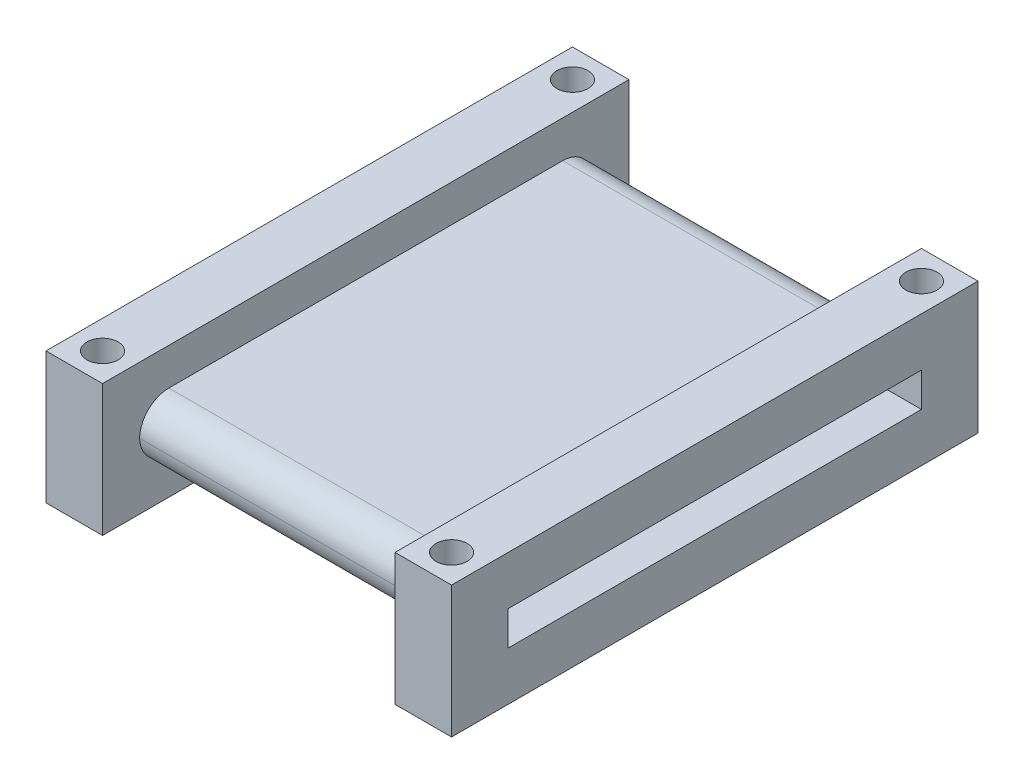
ISO-10303-21;
HEADER;
FILE_DESCRIPTION(('STEP AP214'),'2;1');
FILE_NAME('part.step','',(''),(''),'','','');
FILE_SCHEMA(('AUTOMOTIVE_DESIGN { 1 0 10303 214 1 1 1 1 }'));
ENDSEC;
DATA;
#1=APPLICATION_CONTEXT('core data for automotive mechanical design processes');
#2=APPLICATION_PROTOCOL_DEFINITION('international standard','automotive_design',2000,#1);
#3=PRODUCT_CONTEXT('',#1,'mechanical');
#4=PRODUCT('Part','Part','',(#3));
#5=PRODUCT_RELATED_PRODUCT_CATEGORY('part','',(#4));
#6=PRODUCT_DEFINITION_FORMATION('','',#4);
#7=PRODUCT_DEFINITION_CONTEXT('part definition',#1,'design');
#8=PRODUCT_DEFINITION('design','',#6,#7);
#9=PRODUCT_DEFINITION_SHAPE('','',#8);
#10=(LENGTH_UNIT() NAMED_UNIT(*) SI_UNIT(.MILLI.,.METRE.));
#11=(NAMED_UNIT(*) PLANE_ANGLE_UNIT() SI_UNIT($,.RADIAN.));
#12=(NAMED_UNIT(*) SI_UNIT($,.STERADIAN.) SOLID_ANGLE_UNIT());
#13=UNCERTAINTY_MEASURE_WITH_UNIT(LENGTH_MEASURE(1.E-05),#10,'distance_accuracy_value','');
#14=(GEOMETRIC_REPRESENTATION_CONTEXT(3) GLOBAL_UNCERTAINTY_ASSIGNED_CONTEXT((#13)) GLOBAL_UNIT_ASSIGNED_CONTEXT((#10,
#11,#12)) REPRESENTATION_CONTEXT('',''));
#15=CARTESIAN_POINT('',(0.,0.,0.));
#16=DIRECTION('',(0.,0.,1.));
#17=DIRECTION('',(1.,0.,0.));
#18=AXIS2_PLACEMENT_3D('',#15,#16,#17);
#19=CARTESIAN_POINT('',(30.,0.,0.));
#20=DIRECTION('',(0.,1.,0.));
#21=DIRECTION('',(0.,0.,1.));
#22=AXIS2_PLACEMENT_3D('',#19,#20,#21);
#23=PLANE('',#22);
#24=DIRECTION('',(0.,0.,-1.));
#25=VECTOR('',#24,1.);
#26=CARTESIAN_POINT('',(0.,0.,0.));
#27=LINE('',#26,#25);
#28=CARTESIAN_POINT('',(0.,0.,-3.));
#29=VERTEX_POINT('',#28);
#30=CARTESIAN_POINT('',(0.,0.,-43.4));
#31=VERTEX_POINT('',#30);
#32=EDGE_CURVE('E312',#29,#31,#27,.T.);
#33=ORIENTED_EDGE('',*,*,#32,.T.);
#34=DIRECTION('',(-1.,0.,0.));
#35=VECTOR('',#34,1.);
#36=CARTESIAN_POINT('',(30.,0.,-43.4));
#37=LINE('',#36,#35);
#38=CARTESIAN_POINT('',(30.,0.,-43.4));
#39=VERTEX_POINT('',#38);
#40=EDGE_CURVE('E347',#31,#39,#37,.F.);
#41=ORIENTED_EDGE('',*,*,#40,.T.);
#42=DIRECTION('',(0.,0.,-1.));
#43=VECTOR('',#42,1.);
#44=CARTESIAN_POINT('',(30.,0.,0.));
#45=LINE('',#44,#43);
#46=CARTESIAN_POINT('',(30.,0.,-3.));
#47=VERTEX_POINT('',#46);
#48=EDGE_CURVE('E313',#47,#39,#45,.T.);
#49=ORIENTED_EDGE('',*,*,#48,.F.);
#50=DIRECTION('',(-1.,0.,0.));
#51=VECTOR('',#50,1.);
#52=CARTESIAN_POINT('',(30.,0.,-3.));
#53=LINE('',#52,#51);
#54=EDGE_CURVE('E343',#47,#29,#53,.T.);
#55=ORIENTED_EDGE('',*,*,#54,.T.);
#56=EDGE_LOOP('',(#33,#41,#49,#55));
#57=FACE_BOUND('',#56,.T.);
#58=ADVANCED_FACE('F43',(#57),#23,.F.);
#59=CARTESIAN_POINT('',(30.,5.9,0.));
#60=DIRECTION('',(0.,-1.,0.));
#61=DIRECTION('',(0.,0.,-1.));
#62=AXIS2_PLACEMENT_3D('',#59,#60,#61);
#63=PLANE('',#62);
#64=DIRECTION('',(0.,0.,1.));
#65=VECTOR('',#64,1.);
#66=CARTESIAN_POINT('',(0.,5.9,0.));
#67=LINE('',#66,#65);
#68=CARTESIAN_POINT('',(0.,5.9,-43.4));
#69=VERTEX_POINT('',#68);
#70=CARTESIAN_POINT('',(0.,5.9,-3.));
#71=VERTEX_POINT('',#70);
#72=EDGE_CURVE('E318',#69,#71,#67,.T.);
#73=ORIENTED_EDGE('',*,*,#72,.T.);
#74=DIRECTION('',(-1.,0.,0.));
#75=VECTOR('',#74,1.);
#76=CARTESIAN_POINT('',(30.,5.9,-3.));
#77=LINE('',#76,#75);
#78=CARTESIAN_POINT('',(30.,5.9,-3.));
#79=VERTEX_POINT('',#78);
#80=EDGE_CURVE('E11',#71,#79,#77,.F.);
#81=ORIENTED_EDGE('',*,*,#80,.T.);
#82=DIRECTION('',(0.,0.,1.));
#83=VECTOR('',#82,1.);
#84=CARTESIAN_POINT('',(30.,5.9,0.));
#85=LINE('',#84,#83);
#86=CARTESIAN_POINT('',(30.,5.9,-43.4));
#87=VERTEX_POINT('',#86);
#88=EDGE_CURVE('E317',#87,#79,#85,.T.);
#89=ORIENTED_EDGE('',*,*,#88,.F.);
#90=DIRECTION('',(-1.,0.,0.));
#91=VECTOR('',#90,1.);
#92=CARTESIAN_POINT('',(30.,5.9,-43.4));
#93=LINE('',#92,#91);
#94=EDGE_CURVE('E53',#87,#69,#93,.T.);
#95=ORIENTED_EDGE('',*,*,#94,.T.);
#96=EDGE_LOOP('',(#73,#81,#89,#95));
#97=FACE_BOUND('',#96,.T.);
#98=ADVANCED_FACE('F383',(#97),#63,.F.);
#99=CARTESIAN_POINT('',(30.,1.2,-44.4));
#100=DIRECTION('',(0.,0.,1.));
#101=DIRECTION('',(1.,0.,0.));
#102=AXIS2_PLACEMENT_3D('',#99,#100,#101);
#103=PLANE('',#102);
#104=DIRECTION('',(-1.,0.,0.));
#105=VECTOR('',#104,1.);
#106=CARTESIAN_POINT('',(30.,4.7,-44.4));
#107=LINE('',#106,#105);
#108=CARTESIAN_POINT('',(35.8,4.7,-44.4));
#109=VERTEX_POINT('',#108);
#110=CARTESIAN_POINT('',(-5.8,4.7,-44.4));
#111=VERTEX_POINT('',#110);
#112=EDGE_CURVE('E189',#109,#111,#107,.T.);
#113=ORIENTED_EDGE('',*,*,#112,.T.);
#114=DIRECTION('',(0.,-1.,0.));
#115=VECTOR('',#114,1.);
#116=CARTESIAN_POINT('',(-5.8,1.2,-44.4));
#117=LINE('',#116,#115);
#118=CARTESIAN_POINT('',(-5.8,1.2,-44.4));
#119=VERTEX_POINT('',#118);
#120=EDGE_CURVE('E187',#111,#119,#117,.T.);
#121=ORIENTED_EDGE('',*,*,#120,.T.);
#122=DIRECTION('',(-1.,0.,0.));
#123=VECTOR('',#122,1.);
#124=CARTESIAN_POINT('',(30.,1.2,-44.4));
#125=LINE('',#124,#123);
#126=CARTESIAN_POINT('',(35.8,1.2,-44.4));
#127=VERTEX_POINT('',#126);
#128=EDGE_CURVE('E171',#127,#119,#125,.T.);
#129=ORIENTED_EDGE('',*,*,#128,.F.);
#130=DIRECTION('',(0.,1.,0.));
#131=VECTOR('',#130,1.);
#132=CARTESIAN_POINT('',(35.8,1.2,-44.4));
#133=LINE('',#132,#131);
#134=EDGE_CURVE('E256',#127,#109,#133,.T.);
#135=ORIENTED_EDGE('',*,*,#134,.T.);
#136=EDGE_LOOP('',(#113,#121,#129,#135));
#137=FACE_BOUND('',#136,.T.);
#138=ADVANCED_FACE('F188',(#137),#103,.T.);
#139=CARTESIAN_POINT('',(30.,4.7,-2.));
#140=DIRECTION('',(0.,-1.,0.));
#141=DIRECTION('',(0.,0.,-1.));
#142=AXIS2_PLACEMENT_3D('',#139,#140,#141);
#143=PLANE('',#142);
#144=DIRECTION('',(-1.,0.,0.));
#145=VECTOR('',#144,1.);
#146=CARTESIAN_POINT('',(30.,4.7,-2.));
#147=LINE('',#146,#145);
#148=CARTESIAN_POINT('',(35.8,4.7,-2.));
#149=VERTEX_POINT('',#148);
#150=CARTESIAN_POINT('',(-5.8,4.7,-2.));
#151=VERTEX_POINT('',#150);
#152=EDGE_CURVE('E307',#149,#151,#147,.T.);
#153=ORIENTED_EDGE('',*,*,#152,.T.);
#154=DIRECTION('',(0.,0.,-1.));
#155=VECTOR('',#154,1.);
#156=CARTESIAN_POINT('',(-5.8,4.7,-2.));
#157=LINE('',#156,#155);
#158=EDGE_CURVE('E202',#151,#111,#157,.T.);
#159=ORIENTED_EDGE('',*,*,#158,.T.);
#160=ORIENTED_EDGE('',*,*,#112,.F.);
#161=DIRECTION('',(0.,0.,1.));
#162=VECTOR('',#161,1.);
#163=CARTESIAN_POINT('',(35.8,4.7,-44.4));
#164=LINE('',#163,#162);
#165=EDGE_CURVE('E259',#109,#149,#164,.T.);
#166=ORIENTED_EDGE('',*,*,#165,.T.);
#167=EDGE_LOOP('',(#153,#159,#160,#166));
#168=FACE_BOUND('',#167,.T.);
#169=ADVANCED_FACE('F403',(#168),#143,.T.);
#170=CARTESIAN_POINT('',(30.,1.2,-2.));
#171=DIRECTION('',(0.,0.,-1.));
#172=DIRECTION('',(-1.,0.,0.));
#173=AXIS2_PLACEMENT_3D('',#170,#171,#172);
#174=PLANE('',#173);
#175=DIRECTION('',(-1.,0.,0.));
#176=VECTOR('',#175,1.);
#177=CARTESIAN_POINT('',(30.,1.2,-2.));
#178=LINE('',#177,#176);
#179=CARTESIAN_POINT('',(35.8,1.2,-2.));
#180=VERTEX_POINT('',#179);
#181=CARTESIAN_POINT('',(-5.8,1.2,-2.));
#182=VERTEX_POINT('',#181);
#183=EDGE_CURVE('E183',#180,#182,#178,.T.);
#184=ORIENTED_EDGE('',*,*,#183,.T.);
#185=DIRECTION('',(0.,1.,0.));
#186=VECTOR('',#185,1.);
#187=CARTESIAN_POINT('',(-5.8,1.2,-2.));
#188=LINE('',#187,#186);
#189=EDGE_CURVE('E198',#182,#151,#188,.T.);
#190=ORIENTED_EDGE('',*,*,#189,.T.);
#191=ORIENTED_EDGE('',*,*,#152,.F.);
#192=DIRECTION('',(0.,-1.,0.));
#193=VECTOR('',#192,1.);
#194=CARTESIAN_POINT('',(35.8,1.2,-2.));
#195=LINE('',#194,#193);
#196=EDGE_CURVE('E250',#149,#180,#195,.T.);
#197=ORIENTED_EDGE('',*,*,#196,.T.);
#198=EDGE_LOOP('',(#184,#190,#191,#197));
#199=FACE_BOUND('',#198,.T.);
#200=ADVANCED_FACE('F406',(#199),#174,.T.);
#201=CARTESIAN_POINT('',(30.,1.2,-2.));
#202=DIRECTION('',(0.,1.,0.));
#203=DIRECTION('',(0.,0.,1.));
#204=AXIS2_PLACEMENT_3D('',#201,#202,#203);
#205=PLANE('',#204);
#206=ORIENTED_EDGE('',*,*,#128,.T.);
#207=DIRECTION('',(0.,0.,1.));
#208=VECTOR('',#207,1.);
#209=CARTESIAN_POINT('',(-5.8,1.2,-2.));
#210=LINE('',#209,#208);
#211=EDGE_CURVE('E175',#119,#182,#210,.T.);
#212=ORIENTED_EDGE('',*,*,#211,.T.);
#213=ORIENTED_EDGE('',*,*,#183,.F.);
#214=DIRECTION('',(0.,0.,-1.));
#215=VECTOR('',#214,1.);
#216=CARTESIAN_POINT('',(35.8,1.2,-44.4));
#217=LINE('',#216,#215);
#218=EDGE_CURVE('E178',#180,#127,#217,.T.);
#219=ORIENTED_EDGE('',*,*,#218,.T.);
#220=EDGE_LOOP('',(#206,#212,#213,#219));
#221=FACE_BOUND('',#220,.T.);
#222=ADVANCED_FACE('F173',(#221),#205,.T.);
#223=CARTESIAN_POINT('',(30.,2.9,-43.4));
#224=DIRECTION('',(-1.,0.,0.));
#225=DIRECTION('',(0.,0.,1.));
#226=AXIS2_PLACEMENT_3D('',#223,#224,#225);
#227=CYLINDRICAL_SURFACE('',#226,3.);
#228=ORIENTED_EDGE('',*,*,#94,.F.);
#229=CARTESIAN_POINT('',(30.,2.9,-43.4));
#230=DIRECTION('',(-1.,0.,0.));
#231=DIRECTION('',(0.,0.,1.));
#232=AXIS2_PLACEMENT_3D('',#229,#230,#231);
#233=CIRCLE('',#232,3.);
#234=CARTESIAN_POINT('',(30.,2.95,-46.3995833043941));
#235=VERTEX_POINT('',#234);
#236=EDGE_CURVE('E68',#235,#87,#233,.F.);
#237=ORIENTED_EDGE('',*,*,#236,.F.);
#238=DIRECTION('',(-1.,0.,0.));
#239=VECTOR('',#238,1.);
#240=CARTESIAN_POINT('',(15.,2.95,-46.3995833043941));
#241=LINE('',#240,#239);
#242=CARTESIAN_POINT('',(0.,2.95,-46.3995833043941));
#243=VERTEX_POINT('',#242);
#244=EDGE_CURVE('E184',#243,#235,#241,.F.);
#245=ORIENTED_EDGE('',*,*,#244,.F.);
#246=CARTESIAN_POINT('',(0.,2.9,-43.4));
#247=DIRECTION('',(-1.,0.,0.));
#248=DIRECTION('',(0.,0.,1.));
#249=AXIS2_PLACEMENT_3D('',#246,#247,#248);
#250=CIRCLE('',#249,3.);
#251=EDGE_CURVE('E322',#69,#243,#250,.T.);
#252=ORIENTED_EDGE('',*,*,#251,.F.);
#253=EDGE_LOOP('',(#228,#237,#245,#252));
#254=FACE_BOUND('',#253,.T.);
#255=ADVANCED_FACE('F385',(#254),#227,.T.);
#256=CARTESIAN_POINT('',(30.,3.,-43.4));
#257=DIRECTION('',(-1.,0.,0.));
#258=DIRECTION('',(0.,0.,1.));
#259=AXIS2_PLACEMENT_3D('',#256,#257,#258);
#260=CYLINDRICAL_SURFACE('',#259,3.);
#261=CARTESIAN_POINT('',(30.,3.,-43.4));
#262=DIRECTION('',(-1.,0.,0.));
#263=DIRECTION('',(0.,0.,1.));
#264=AXIS2_PLACEMENT_3D('',#261,#262,#263);
#265=CIRCLE('',#264,3.);
#266=EDGE_CURVE('E353',#39,#235,#265,.F.);
#267=ORIENTED_EDGE('',*,*,#266,.F.);
#268=ORIENTED_EDGE('',*,*,#40,.F.);
#269=CARTESIAN_POINT('',(0.,3.,-43.4));
#270=DIRECTION('',(-1.,0.,0.));
#271=DIRECTION('',(0.,0.,1.));
#272=AXIS2_PLACEMENT_3D('',#269,#270,#271);
#273=CIRCLE('',#272,3.);
#274=EDGE_CURVE('E331',#243,#31,#273,.T.);
#275=ORIENTED_EDGE('',*,*,#274,.F.);
#276=ORIENTED_EDGE('',*,*,#244,.T.);
#277=EDGE_LOOP('',(#267,#268,#275,#276));
#278=FACE_BOUND('',#277,.T.);
#279=ADVANCED_FACE('F386',(#278),#260,.T.);
#280=CARTESIAN_POINT('',(30.,2.9,-3.));
#281=DIRECTION('',(-1.,0.,0.));
#282=DIRECTION('',(0.,0.,1.));
#283=AXIS2_PLACEMENT_3D('',#280,#281,#282);
#284=CYLINDRICAL_SURFACE('',#283,3.);
#285=DIRECTION('',(-1.,0.,0.));
#286=VECTOR('',#285,1.);
#287=CARTESIAN_POINT('',(15.,2.95,-0.000416695605871559));
#288=LINE('',#287,#286);
#289=CARTESIAN_POINT('',(30.,2.95,-0.000416695605871126));
#290=VERTEX_POINT('',#289);
#291=CARTESIAN_POINT('',(0.,2.95,-0.000416695605871126));
#292=VERTEX_POINT('',#291);
#293=EDGE_CURVE('E47',#290,#292,#288,.T.);
#294=ORIENTED_EDGE('',*,*,#293,.F.);
#295=CARTESIAN_POINT('',(30.,2.9,-3.));
#296=DIRECTION('',(-1.,0.,0.));
#297=DIRECTION('',(0.,0.,1.));
#298=AXIS2_PLACEMENT_3D('',#295,#296,#297);
#299=CIRCLE('',#298,3.);
#300=EDGE_CURVE('E357',#79,#290,#299,.F.);
#301=ORIENTED_EDGE('',*,*,#300,.F.);
#302=ORIENTED_EDGE('',*,*,#80,.F.);
#303=CARTESIAN_POINT('',(0.,2.9,-3.));
#304=DIRECTION('',(-1.,0.,0.));
#305=DIRECTION('',(0.,0.,1.));
#306=AXIS2_PLACEMENT_3D('',#303,#304,#305);
#307=CIRCLE('',#306,3.);
#308=EDGE_CURVE('E335',#292,#71,#307,.T.);
#309=ORIENTED_EDGE('',*,*,#308,.F.);
#310=EDGE_LOOP('',(#294,#301,#302,#309));
#311=FACE_BOUND('',#310,.T.);
#312=ADVANCED_FACE('F45',(#311),#284,.T.);
#313=CARTESIAN_POINT('',(30.,3.,-3.));
#314=DIRECTION('',(-1.,0.,0.));
#315=DIRECTION('',(0.,0.,1.));
#316=AXIS2_PLACEMENT_3D('',#313,#314,#315);
#317=CYLINDRICAL_SURFACE('',#316,3.);
#318=CARTESIAN_POINT('',(30.,3.,-3.));
#319=DIRECTION('',(-1.,0.,0.));
#320=DIRECTION('',(0.,0.,1.));
#321=AXIS2_PLACEMENT_3D('',#318,#319,#320);
#322=CIRCLE('',#321,3.);
#323=EDGE_CURVE('E361',#290,#47,#322,.F.);
#324=ORIENTED_EDGE('',*,*,#323,.F.);
#325=ORIENTED_EDGE('',*,*,#293,.T.);
#326=CARTESIAN_POINT('',(0.,3.,-3.));
#327=DIRECTION('',(-1.,0.,0.));
#328=DIRECTION('',(0.,0.,1.));
#329=AXIS2_PLACEMENT_3D('',#326,#327,#328);
#330=CIRCLE('',#329,3.);
#331=EDGE_CURVE('E339',#29,#292,#330,.T.);
#332=ORIENTED_EDGE('',*,*,#331,.F.);
#333=ORIENTED_EDGE('',*,*,#54,.F.);
#334=EDGE_LOOP('',(#324,#325,#332,#333));
#335=FACE_BOUND('',#334,.T.);
#336=ADVANCED_FACE('F371',(#335),#317,.T.);
#337=CARTESIAN_POINT('',(35.8,0.,0.));
#338=DIRECTION('',(-1.,0.,0.));
#339=DIRECTION('',(0.,0.,1.));
#340=AXIS2_PLACEMENT_3D('',#337,#338,#339);
#341=PLANE('',#340);
#342=DIRECTION('',(0.,1.,0.));
#343=VECTOR('',#342,1.);
#344=CARTESIAN_POINT('',(35.8,-3.8,-50.2));
#345=LINE('',#344,#343);
#346=CARTESIAN_POINT('',(35.8,-3.8,-50.2));
#347=VERTEX_POINT('',#346);
#348=CARTESIAN_POINT('',(35.8,9.7,-50.2));
#349=VERTEX_POINT('',#348);
#350=EDGE_CURVE('E264',#347,#349,#345,.T.);
#351=ORIENTED_EDGE('',*,*,#350,.T.);
#352=DIRECTION('',(0.,0.,1.));
#353=VECTOR('',#352,1.);
#354=CARTESIAN_POINT('',(35.8,9.7,3.8));
#355=LINE('',#354,#353);
#356=CARTESIAN_POINT('',(35.8,9.7,3.8));
#357=VERTEX_POINT('',#356);
#358=EDGE_CURVE('E268',#349,#357,#355,.T.);
#359=ORIENTED_EDGE('',*,*,#358,.T.);
#360=DIRECTION('',(0.,-1.,0.));
#361=VECTOR('',#360,1.);
#362=CARTESIAN_POINT('',(35.8,-3.8,3.8));
#363=LINE('',#362,#361);
#364=CARTESIAN_POINT('',(35.8,-3.8,3.8));
#365=VERTEX_POINT('',#364);
#366=EDGE_CURVE('E272',#357,#365,#363,.T.);
#367=ORIENTED_EDGE('',*,*,#366,.T.);
#368=DIRECTION('',(0.,0.,-1.));
#369=VECTOR('',#368,1.);
#370=CARTESIAN_POINT('',(35.8,-3.8,3.8));
#371=LINE('',#370,#369);
#372=EDGE_CURVE('E275',#365,#347,#371,.T.);
#373=ORIENTED_EDGE('',*,*,#372,.T.);
#374=EDGE_LOOP('',(#351,#359,#367,#373));
#375=FACE_BOUND('',#374,.T.);
#376=ORIENTED_EDGE('',*,*,#196,.F.);
#377=ORIENTED_EDGE('',*,*,#165,.F.);
#378=ORIENTED_EDGE('',*,*,#134,.F.);
#379=ORIENTED_EDGE('',*,*,#218,.F.);
#380=EDGE_LOOP('',(#376,#377,#378,#379));
#381=FACE_BOUND('',#380,.T.);
#382=ADVANCED_FACE('F431',(#375,#381),#341,.F.);
#383=CARTESIAN_POINT('',(30.,0.,0.));
#384=DIRECTION('',(-1.,0.,0.));
#385=DIRECTION('',(0.,0.,1.));
#386=AXIS2_PLACEMENT_3D('',#383,#384,#385);
#387=PLANE('',#386);
#388=ORIENTED_EDGE('',*,*,#88,.T.);
#389=ORIENTED_EDGE('',*,*,#300,.T.);
#390=ORIENTED_EDGE('',*,*,#323,.T.);
#391=ORIENTED_EDGE('',*,*,#48,.T.);
#392=ORIENTED_EDGE('',*,*,#266,.T.);
#393=ORIENTED_EDGE('',*,*,#236,.T.);
#394=EDGE_LOOP('',(#388,#389,#390,#391,#392,#393));
#395=FACE_BOUND('',#394,.T.);
#396=DIRECTION('',(0.,1.,0.));
#397=VECTOR('',#396,1.);
#398=CARTESIAN_POINT('',(30.,-3.8,-50.2));
#399=LINE('',#398,#397);
#400=CARTESIAN_POINT('',(30.,-3.8,-50.2));
#401=VERTEX_POINT('',#400);
#402=CARTESIAN_POINT('',(30.,9.7,-50.2));
#403=VERTEX_POINT('',#402);
#404=EDGE_CURVE('E263',#401,#403,#399,.T.);
#405=ORIENTED_EDGE('',*,*,#404,.F.);
#406=DIRECTION('',(0.,0.,-1.));
#407=VECTOR('',#406,1.);
#408=CARTESIAN_POINT('',(30.,-3.8,3.8));
#409=LINE('',#408,#407);
#410=CARTESIAN_POINT('',(30.,-3.8,3.8));
#411=VERTEX_POINT('',#410);
#412=EDGE_CURVE('E269',#411,#401,#409,.T.);
#413=ORIENTED_EDGE('',*,*,#412,.F.);
#414=DIRECTION('',(0.,-1.,0.));
#415=VECTOR('',#414,1.);
#416=CARTESIAN_POINT('',(30.,-3.8,3.8));
#417=LINE('',#416,#415);
#418=CARTESIAN_POINT('',(30.,9.7,3.8));
#419=VERTEX_POINT('',#418);
#420=EDGE_CURVE('E285',#419,#411,#417,.T.);
#421=ORIENTED_EDGE('',*,*,#420,.F.);
#422=DIRECTION('',(0.,0.,1.));
#423=VECTOR('',#422,1.);
#424=CARTESIAN_POINT('',(30.,9.7,3.8));
#425=LINE('',#424,#423);
#426=EDGE_CURVE('E282',#403,#419,#425,.T.);
#427=ORIENTED_EDGE('',*,*,#426,.F.);
#428=EDGE_LOOP('',(#405,#413,#421,#427));
#429=FACE_BOUND('',#428,.T.);
#430=ADVANCED_FACE('F379',(#395,#429),#387,.T.);
#431=CARTESIAN_POINT('',(35.8,-3.8,-50.2));
#432=DIRECTION('',(0.,0.,1.));
#433=DIRECTION('',(1.,0.,0.));
#434=AXIS2_PLACEMENT_3D('',#431,#432,#433);
#435=PLANE('',#434);
#436=ORIENTED_EDGE('',*,*,#404,.T.);
#437=DIRECTION('',(-1.,0.,0.));
#438=VECTOR('',#437,1.);
#439=CARTESIAN_POINT('',(35.8,9.7,-50.2));
#440=LINE('',#439,#438);
#441=EDGE_CURVE('E301',#349,#403,#440,.T.);
#442=ORIENTED_EDGE('',*,*,#441,.F.);
#443=ORIENTED_EDGE('',*,*,#350,.F.);
#444=DIRECTION('',(-1.,0.,0.));
#445=VECTOR('',#444,1.);
#446=CARTESIAN_POINT('',(35.8,-3.8,-50.2));
#447=LINE('',#446,#445);
#448=EDGE_CURVE('E278',#347,#401,#447,.T.);
#449=ORIENTED_EDGE('',*,*,#448,.T.);
#450=EDGE_LOOP('',(#436,#442,#443,#449));
#451=FACE_BOUND('',#450,.T.);
#452=ADVANCED_FACE('F413',(#451),#435,.F.);
#453=CARTESIAN_POINT('',(35.8,9.7,3.8));
#454=DIRECTION('',(0.,-1.,0.));
#455=DIRECTION('',(0.,0.,-1.));
#456=AXIS2_PLACEMENT_3D('',#453,#454,#455);
#457=PLANE('',#456);
#458=CARTESIAN_POINT('',(32.9,9.7,-47.3));
#459=DIRECTION('',(0.,1.,0.));
#460=DIRECTION('',(0.,0.,1.));
#461=AXIS2_PLACEMENT_3D('',#458,#459,#460);
#462=CIRCLE('',#461,1.6);
#463=CARTESIAN_POINT('',(32.9,9.7,-45.7));
#464=VERTEX_POINT('',#463);
#465=EDGE_CURVE('E492',#464,#464,#462,.T.);
#466=ORIENTED_EDGE('',*,*,#465,.F.);
#467=EDGE_LOOP('',(#466));
#468=FACE_BOUND('',#467,.T.);
#469=CARTESIAN_POINT('',(32.9,9.7,0.900000000000001));
#470=DIRECTION('',(0.,1.,0.));
#471=DIRECTION('',(0.,0.,1.));
#472=AXIS2_PLACEMENT_3D('',#469,#470,#471);
#473=CIRCLE('',#472,1.6);
#474=CARTESIAN_POINT('',(32.9,9.7,2.5));
#475=VERTEX_POINT('',#474);
#476=EDGE_CURVE('E480',#475,#475,#473,.T.);
#477=ORIENTED_EDGE('',*,*,#476,.F.);
#478=EDGE_LOOP('',(#477));
#479=FACE_BOUND('',#478,.T.);
#480=ORIENTED_EDGE('',*,*,#426,.T.);
#481=DIRECTION('',(-1.,0.,0.));
#482=VECTOR('',#481,1.);
#483=CARTESIAN_POINT('',(35.8,9.7,3.8));
#484=LINE('',#483,#482);
#485=EDGE_CURVE('E297',#357,#419,#484,.T.);
#486=ORIENTED_EDGE('',*,*,#485,.F.);
#487=ORIENTED_EDGE('',*,*,#358,.F.);
#488=ORIENTED_EDGE('',*,*,#441,.T.);
#489=EDGE_LOOP('',(#480,#486,#487,#488));
#490=FACE_BOUND('',#489,.T.);
#491=ADVANCED_FACE('F416',(#468,#479,#490),#457,.F.);
#492=CARTESIAN_POINT('',(35.8,-3.8,3.8));
#493=DIRECTION('',(0.,0.,-1.));
#494=DIRECTION('',(-1.,0.,0.));
#495=AXIS2_PLACEMENT_3D('',#492,#493,#494);
#496=PLANE('',#495);
#497=ORIENTED_EDGE('',*,*,#420,.T.);
#498=DIRECTION('',(-1.,0.,0.));
#499=VECTOR('',#498,1.);
#500=CARTESIAN_POINT('',(35.8,-3.8,3.8));
#501=LINE('',#500,#499);
#502=EDGE_CURVE('E293',#365,#411,#501,.T.);
#503=ORIENTED_EDGE('',*,*,#502,.F.);
#504=ORIENTED_EDGE('',*,*,#366,.F.);
#505=ORIENTED_EDGE('',*,*,#485,.T.);
#506=EDGE_LOOP('',(#497,#503,#504,#505));
#507=FACE_BOUND('',#506,.T.);
#508=ADVANCED_FACE('F420',(#507),#496,.F.);
#509=CARTESIAN_POINT('',(35.8,-3.8,3.8));
#510=DIRECTION('',(0.,1.,0.));
#511=DIRECTION('',(0.,0.,1.));
#512=AXIS2_PLACEMENT_3D('',#509,#510,#511);
#513=PLANE('',#512);
#514=CARTESIAN_POINT('',(32.9,-3.8,-47.3));
#515=DIRECTION('',(0.,1.,0.));
#516=DIRECTION('',(0.,0.,1.));
#517=AXIS2_PLACEMENT_3D('',#514,#515,#516);
#518=CIRCLE('',#517,1.6);
#519=CARTESIAN_POINT('',(32.9,-3.8,-45.7));
#520=VERTEX_POINT('',#519);
#521=EDGE_CURVE('E497',#520,#520,#518,.T.);
#522=ORIENTED_EDGE('',*,*,#521,.T.);
#523=EDGE_LOOP('',(#522));
#524=FACE_BOUND('',#523,.T.);
#525=CARTESIAN_POINT('',(32.9,-3.8,0.900000000000001));
#526=DIRECTION('',(0.,1.,0.));
#527=DIRECTION('',(0.,0.,1.));
#528=AXIS2_PLACEMENT_3D('',#525,#526,#527);
#529=CIRCLE('',#528,1.6);
#530=CARTESIAN_POINT('',(32.9,-3.8,2.5));
#531=VERTEX_POINT('',#530);
#532=EDGE_CURVE('E477',#531,#531,#529,.T.);
#533=ORIENTED_EDGE('',*,*,#532,.T.);
#534=EDGE_LOOP('',(#533));
#535=FACE_BOUND('',#534,.T.);
#536=ORIENTED_EDGE('',*,*,#412,.T.);
#537=ORIENTED_EDGE('',*,*,#448,.F.);
#538=ORIENTED_EDGE('',*,*,#372,.F.);
#539=ORIENTED_EDGE('',*,*,#502,.T.);
#540=EDGE_LOOP('',(#536,#537,#538,#539));
#541=FACE_BOUND('',#540,.T.);
#542=ADVANCED_FACE('F424',(#524,#535,#541),#513,.F.);
#543=CARTESIAN_POINT('',(0.,0.,0.));
#544=DIRECTION('',(-1.,0.,0.));
#545=DIRECTION('',(0.,0.,1.));
#546=AXIS2_PLACEMENT_3D('',#543,#544,#545);
#547=PLANE('',#546);
#548=DIRECTION('',(0.,-1.,0.));
#549=VECTOR('',#548,1.);
#550=CARTESIAN_POINT('',(0.,-3.8,-50.2));
#551=LINE('',#550,#549);
#552=CARTESIAN_POINT('',(0.,9.7,-50.2));
#553=VERTEX_POINT('',#552);
#554=CARTESIAN_POINT('',(0.,-3.8,-50.2));
#555=VERTEX_POINT('',#554);
#556=EDGE_CURVE('E208',#553,#555,#551,.T.);
#557=ORIENTED_EDGE('',*,*,#556,.F.);
#558=DIRECTION('',(0.,0.,-1.));
#559=VECTOR('',#558,1.);
#560=CARTESIAN_POINT('',(0.,9.7,3.8));
#561=LINE('',#560,#559);
#562=CARTESIAN_POINT('',(0.,9.7,3.8));
#563=VERTEX_POINT('',#562);
#564=EDGE_CURVE('E214',#563,#553,#561,.T.);
#565=ORIENTED_EDGE('',*,*,#564,.F.);
#566=DIRECTION('',(0.,1.,0.));
#567=VECTOR('',#566,1.);
#568=CARTESIAN_POINT('',(0.,-3.8,3.8));
#569=LINE('',#568,#567);
#570=CARTESIAN_POINT('',(0.,-3.8,3.8));
#571=VERTEX_POINT('',#570);
#572=EDGE_CURVE('E230',#571,#563,#569,.T.);
#573=ORIENTED_EDGE('',*,*,#572,.F.);
#574=DIRECTION('',(0.,0.,1.));
#575=VECTOR('',#574,1.);
#576=CARTESIAN_POINT('',(0.,-3.8,3.8));
#577=LINE('',#576,#575);
#578=EDGE_CURVE('E227',#555,#571,#577,.T.);
#579=ORIENTED_EDGE('',*,*,#578,.F.);
#580=EDGE_LOOP('',(#557,#565,#573,#579));
#581=FACE_BOUND('',#580,.T.);
#582=ORIENTED_EDGE('',*,*,#32,.F.);
#583=ORIENTED_EDGE('',*,*,#331,.T.);
#584=ORIENTED_EDGE('',*,*,#308,.T.);
#585=ORIENTED_EDGE('',*,*,#72,.F.);
#586=ORIENTED_EDGE('',*,*,#251,.T.);
#587=ORIENTED_EDGE('',*,*,#274,.T.);
#588=EDGE_LOOP('',(#582,#583,#584,#585,#586,#587));
#589=FACE_BOUND('',#588,.T.);
#590=ADVANCED_FACE('F375',(#581,#589),#547,.F.);
#591=CARTESIAN_POINT('',(-5.8,0.,0.));
#592=DIRECTION('',(-1.,0.,0.));
#593=DIRECTION('',(0.,0.,1.));
#594=AXIS2_PLACEMENT_3D('',#591,#592,#593);
#595=PLANE('',#594);
#596=DIRECTION('',(0.,-1.,0.));
#597=VECTOR('',#596,1.);
#598=CARTESIAN_POINT('',(-5.8,-3.8,-50.2));
#599=LINE('',#598,#597);
#600=CARTESIAN_POINT('',(-5.8,9.7,-50.2));
#601=VERTEX_POINT('',#600);
#602=CARTESIAN_POINT('',(-5.8,-3.8,-50.2));
#603=VERTEX_POINT('',#602);
#604=EDGE_CURVE('E209',#601,#603,#599,.T.);
#605=ORIENTED_EDGE('',*,*,#604,.T.);
#606=DIRECTION('',(0.,0.,1.));
#607=VECTOR('',#606,1.);
#608=CARTESIAN_POINT('',(-5.8,-3.8,3.8));
#609=LINE('',#608,#607);
#610=CARTESIAN_POINT('',(-5.8,-3.8,3.8));
#611=VERTEX_POINT('',#610);
#612=EDGE_CURVE('E213',#603,#611,#609,.T.);
#613=ORIENTED_EDGE('',*,*,#612,.T.);
#614=DIRECTION('',(0.,1.,0.));
#615=VECTOR('',#614,1.);
#616=CARTESIAN_POINT('',(-5.8,-3.8,3.8));
#617=LINE('',#616,#615);
#618=CARTESIAN_POINT('',(-5.8,9.7,3.8));
#619=VERTEX_POINT('',#618);
#620=EDGE_CURVE('E217',#611,#619,#617,.T.);
#621=ORIENTED_EDGE('',*,*,#620,.T.);
#622=DIRECTION('',(0.,0.,-1.));
#623=VECTOR('',#622,1.);
#624=CARTESIAN_POINT('',(-5.8,9.7,3.8));
#625=LINE('',#624,#623);
#626=EDGE_CURVE('E220',#619,#601,#625,.T.);
#627=ORIENTED_EDGE('',*,*,#626,.T.);
#628=EDGE_LOOP('',(#605,#613,#621,#627));
#629=FACE_BOUND('',#628,.T.);
#630=ORIENTED_EDGE('',*,*,#211,.F.);
#631=ORIENTED_EDGE('',*,*,#120,.F.);
#632=ORIENTED_EDGE('',*,*,#158,.F.);
#633=ORIENTED_EDGE('',*,*,#189,.F.);
#634=EDGE_LOOP('',(#630,#631,#632,#633));
#635=FACE_BOUND('',#634,.T.);
#636=ADVANCED_FACE('F196',(#629,#635),#595,.T.);
#637=CARTESIAN_POINT('',(-5.8,-3.8,-50.2));
#638=DIRECTION('',(0.,0.,1.));
#639=DIRECTION('',(1.,0.,0.));
#640=AXIS2_PLACEMENT_3D('',#637,#638,#639);
#641=PLANE('',#640);
#642=ORIENTED_EDGE('',*,*,#556,.T.);
#643=DIRECTION('',(1.,0.,0.));
#644=VECTOR('',#643,1.);
#645=CARTESIAN_POINT('',(-5.8,-3.8,-50.2));
#646=LINE('',#645,#644);
#647=EDGE_CURVE('E246',#603,#555,#646,.T.);
#648=ORIENTED_EDGE('',*,*,#647,.F.);
#649=ORIENTED_EDGE('',*,*,#604,.F.);
#650=DIRECTION('',(1.,0.,0.));
#651=VECTOR('',#650,1.);
#652=CARTESIAN_POINT('',(-5.8,9.7,-50.2));
#653=LINE('',#652,#651);
#654=EDGE_CURVE('E223',#601,#553,#653,.T.);
#655=ORIENTED_EDGE('',*,*,#654,.T.);
#656=EDGE_LOOP('',(#642,#648,#649,#655));
#657=FACE_BOUND('',#656,.T.);
#658=ADVANCED_FACE('F435',(#657),#641,.F.);
#659=CARTESIAN_POINT('',(-5.8,-3.8,3.8));
#660=DIRECTION('',(0.,1.,0.));
#661=DIRECTION('',(0.,0.,1.));
#662=AXIS2_PLACEMENT_3D('',#659,#660,#661);
#663=PLANE('',#662);
#664=CARTESIAN_POINT('',(-2.89999999999999,-3.8,0.900000000000007));
#665=DIRECTION('',(0.,1.,0.));
#666=DIRECTION('',(0.,0.,1.));
#667=AXIS2_PLACEMENT_3D('',#664,#665,#666);
#668=CIRCLE('',#667,1.6);
#669=CARTESIAN_POINT('',(-2.89999999999999,-3.8,2.50000000000001));
#670=VERTEX_POINT('',#669);
#671=EDGE_CURVE('E483',#670,#670,#668,.T.);
#672=ORIENTED_EDGE('',*,*,#671,.T.);
#673=EDGE_LOOP('',(#672));
#674=FACE_BOUND('',#673,.T.);
#675=CARTESIAN_POINT('',(-2.9,-3.8,-47.3));
#676=DIRECTION('',(0.,1.,0.));
#677=DIRECTION('',(0.,0.,1.));
#678=AXIS2_PLACEMENT_3D('',#675,#676,#677);
#679=CIRCLE('',#678,1.6);
#680=CARTESIAN_POINT('',(-2.9,-3.8,-45.7));
#681=VERTEX_POINT('',#680);
#682=EDGE_CURVE('E194',#681,#681,#679,.T.);
#683=ORIENTED_EDGE('',*,*,#682,.T.);
#684=EDGE_LOOP('',(#683));
#685=FACE_BOUND('',#684,.T.);
#686=ORIENTED_EDGE('',*,*,#578,.T.);
#687=DIRECTION('',(1.,0.,0.));
#688=VECTOR('',#687,1.);
#689=CARTESIAN_POINT('',(-5.8,-3.8,3.8));
#690=LINE('',#689,#688);
#691=EDGE_CURVE('E242',#611,#571,#690,.T.);
#692=ORIENTED_EDGE('',*,*,#691,.F.);
#693=ORIENTED_EDGE('',*,*,#612,.F.);
#694=ORIENTED_EDGE('',*,*,#647,.T.);
#695=EDGE_LOOP('',(#686,#692,#693,#694));
#696=FACE_BOUND('',#695,.T.);
#697=ADVANCED_FACE('F438',(#674,#685,#696),#663,.F.);
#698=CARTESIAN_POINT('',(-5.8,-3.8,3.8));
#699=DIRECTION('',(0.,0.,-1.));
#700=DIRECTION('',(-1.,0.,0.));
#701=AXIS2_PLACEMENT_3D('',#698,#699,#700);
#702=PLANE('',#701);
#703=ORIENTED_EDGE('',*,*,#572,.T.);
#704=DIRECTION('',(1.,0.,0.));
#705=VECTOR('',#704,1.);
#706=CARTESIAN_POINT('',(-5.8,9.7,3.8));
#707=LINE('',#706,#705);
#708=EDGE_CURVE('E238',#619,#563,#707,.T.);
#709=ORIENTED_EDGE('',*,*,#708,.F.);
#710=ORIENTED_EDGE('',*,*,#620,.F.);
#711=ORIENTED_EDGE('',*,*,#691,.T.);
#712=EDGE_LOOP('',(#703,#709,#710,#711));
#713=FACE_BOUND('',#712,.T.);
#714=ADVANCED_FACE('F442',(#713),#702,.F.);
#715=CARTESIAN_POINT('',(-5.8,9.7,3.8));
#716=DIRECTION('',(0.,-1.,0.));
#717=DIRECTION('',(0.,0.,-1.));
#718=AXIS2_PLACEMENT_3D('',#715,#716,#717);
#719=PLANE('',#718);
#720=CARTESIAN_POINT('',(-2.89999999999999,9.7,0.900000000000007));
#721=DIRECTION('',(0.,1.,0.));
#722=DIRECTION('',(0.,0.,1.));
#723=AXIS2_PLACEMENT_3D('',#720,#721,#722);
#724=CIRCLE('',#723,1.6);
#725=CARTESIAN_POINT('',(-2.89999999999999,9.7,2.50000000000001));
#726=VERTEX_POINT('',#725);
#727=EDGE_CURVE('E488',#726,#726,#724,.T.);
#728=ORIENTED_EDGE('',*,*,#727,.F.);
#729=EDGE_LOOP('',(#728));
#730=FACE_BOUND('',#729,.T.);
#731=CARTESIAN_POINT('',(-2.9,9.7,-47.3));
#732=DIRECTION('',(0.,1.,0.));
#733=DIRECTION('',(0.,0.,1.));
#734=AXIS2_PLACEMENT_3D('',#731,#732,#733);
#735=CIRCLE('',#734,1.6);
#736=CARTESIAN_POINT('',(-2.9,9.7,-45.7));
#737=VERTEX_POINT('',#736);
#738=EDGE_CURVE('E496',#737,#737,#735,.T.);
#739=ORIENTED_EDGE('',*,*,#738,.F.);
#740=EDGE_LOOP('',(#739));
#741=FACE_BOUND('',#740,.T.);
#742=ORIENTED_EDGE('',*,*,#564,.T.);
#743=ORIENTED_EDGE('',*,*,#654,.F.);
#744=ORIENTED_EDGE('',*,*,#626,.F.);
#745=ORIENTED_EDGE('',*,*,#708,.T.);
#746=EDGE_LOOP('',(#742,#743,#744,#745));
#747=FACE_BOUND('',#746,.T.);
#748=ADVANCED_FACE('F446',(#730,#741,#747),#719,.F.);
#749=CARTESIAN_POINT('',(-2.9,-3.8,-47.3));
#750=DIRECTION('',(0.,1.,0.));
#751=DIRECTION('',(0.,0.,1.));
#752=AXIS2_PLACEMENT_3D('',#749,#750,#751);
#753=CYLINDRICAL_SURFACE('',#752,1.6);
#754=ORIENTED_EDGE('',*,*,#682,.F.);
#755=EDGE_LOOP('',(#754));
#756=FACE_BOUND('',#755,.T.);
#757=ORIENTED_EDGE('',*,*,#738,.T.);
#758=EDGE_LOOP('',(#757));
#759=FACE_BOUND('',#758,.T.);
#760=ADVANCED_FACE('F450',(#756,#759),#753,.F.);
#761=CARTESIAN_POINT('',(-2.89999999999999,-3.8,0.900000000000007));
#762=DIRECTION('',(0.,1.,0.));
#763=DIRECTION('',(0.,0.,1.));
#764=AXIS2_PLACEMENT_3D('',#761,#762,#763);
#765=CYLINDRICAL_SURFACE('',#764,1.6);
#766=ORIENTED_EDGE('',*,*,#671,.F.);
#767=EDGE_LOOP('',(#766));
#768=FACE_BOUND('',#767,.T.);
#769=ORIENTED_EDGE('',*,*,#727,.T.);
#770=EDGE_LOOP('',(#769));
#771=FACE_BOUND('',#770,.T.);
#772=ADVANCED_FACE('F460',(#768,#771),#765,.F.);
#773=CARTESIAN_POINT('',(32.9,-3.8,0.900000000000001));
#774=DIRECTION('',(0.,1.,0.));
#775=DIRECTION('',(0.,0.,1.));
#776=AXIS2_PLACEMENT_3D('',#773,#774,#775);
#777=CYLINDRICAL_SURFACE('',#776,1.6);
#778=ORIENTED_EDGE('',*,*,#532,.F.);
#779=EDGE_LOOP('',(#778));
#780=FACE_BOUND('',#779,.T.);
#781=ORIENTED_EDGE('',*,*,#476,.T.);
#782=EDGE_LOOP('',(#781));
#783=FACE_BOUND('',#782,.T.);
#784=ADVANCED_FACE('F464',(#780,#783),#777,.F.);
#785=CARTESIAN_POINT('',(32.9,-3.8,-47.3));
#786=DIRECTION('',(0.,1.,0.));
#787=DIRECTION('',(0.,0.,1.));
#788=AXIS2_PLACEMENT_3D('',#785,#786,#787);
#789=CYLINDRICAL_SURFACE('',#788,1.6);
#790=ORIENTED_EDGE('',*,*,#521,.F.);
#791=EDGE_LOOP('',(#790));
#792=FACE_BOUND('',#791,.T.);
#793=ORIENTED_EDGE('',*,*,#465,.T.);
#794=EDGE_LOOP('',(#793));
#795=FACE_BOUND('',#794,.T.);
#796=ADVANCED_FACE('F466',(#792,#795),#789,.F.);
#797=CLOSED_SHELL('',(#58,#98,#138,#169,#200,#222,#255,#279,#312,#336,#382,#430,#452,#491,#508,
#542,#590,#636,#658,#697,#714,#748,#760,#772,#784,#796));
#798=MANIFOLD_SOLID_BREP('B2',#797);
#799=ADVANCED_BREP_SHAPE_REPRESENTATION('',(#18,#798),#14);
#800=SHAPE_DEFINITION_REPRESENTATION(#9,#799);
ENDSEC;
END-ISO-10303-21;
